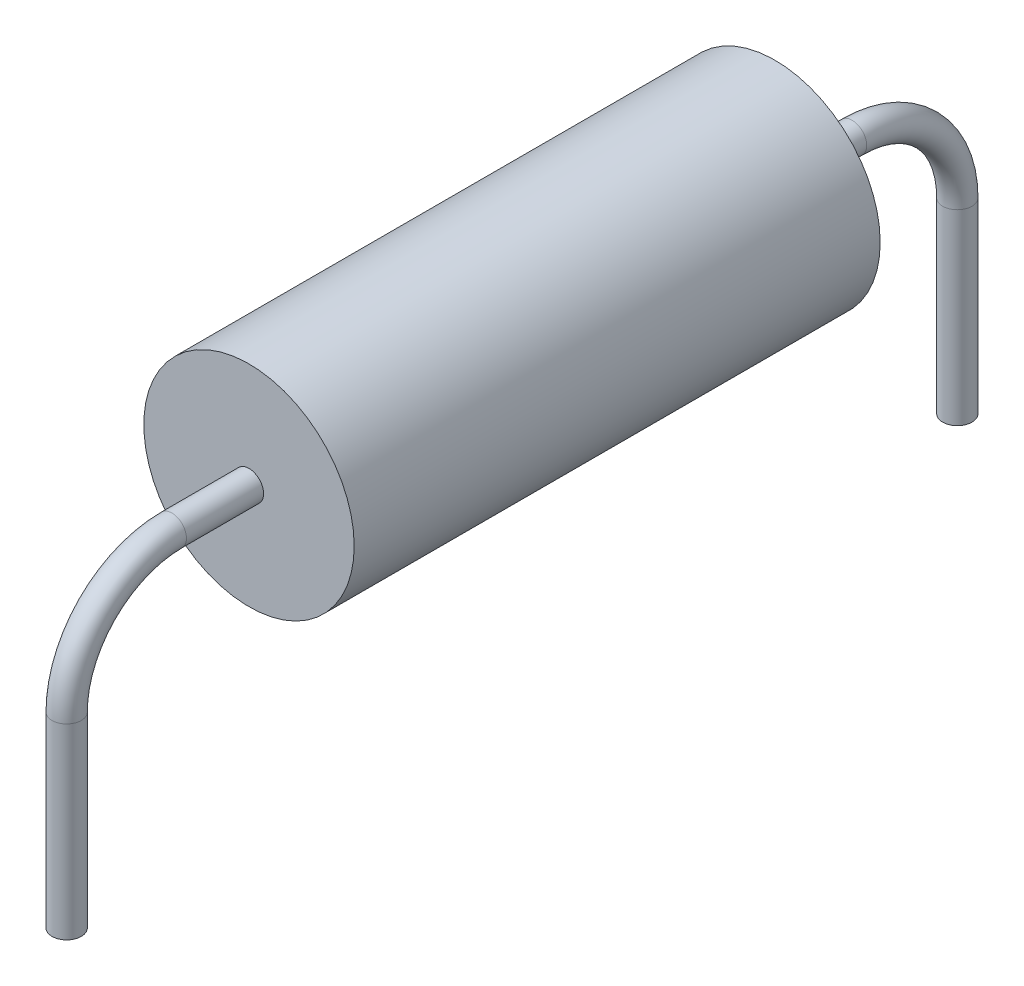
ISO-10303-21;
HEADER;
FILE_DESCRIPTION(('STEP AP214'),'2;1');
FILE_NAME('part.step','',(''),(''),'','','');
FILE_SCHEMA(('AUTOMOTIVE_DESIGN { 1 0 10303 214 1 1 1 1 }'));
ENDSEC;
DATA;
#1=APPLICATION_CONTEXT('core data for automotive mechanical design processes');
#2=APPLICATION_PROTOCOL_DEFINITION('international standard','automotive_design',2000,#1);
#3=PRODUCT_CONTEXT('',#1,'mechanical');
#4=PRODUCT('Part','Part','',(#3));
#5=PRODUCT_RELATED_PRODUCT_CATEGORY('part','',(#4));
#6=PRODUCT_DEFINITION_FORMATION('','',#4);
#7=PRODUCT_DEFINITION_CONTEXT('part definition',#1,'design');
#8=PRODUCT_DEFINITION('design','',#6,#7);
#9=PRODUCT_DEFINITION_SHAPE('','',#8);
#10=(LENGTH_UNIT() NAMED_UNIT(*) SI_UNIT(.MILLI.,.METRE.));
#11=(NAMED_UNIT(*) PLANE_ANGLE_UNIT() SI_UNIT($,.RADIAN.));
#12=(NAMED_UNIT(*) SI_UNIT($,.STERADIAN.) SOLID_ANGLE_UNIT());
#13=UNCERTAINTY_MEASURE_WITH_UNIT(LENGTH_MEASURE(1.E-05),#10,'distance_accuracy_value','');
#14=(GEOMETRIC_REPRESENTATION_CONTEXT(3) GLOBAL_UNCERTAINTY_ASSIGNED_CONTEXT((#13)) GLOBAL_UNIT_ASSIGNED_CONTEXT((#10,
#11,#12)) REPRESENTATION_CONTEXT('',''));
#15=CARTESIAN_POINT('',(0.,0.,0.));
#16=DIRECTION('',(0.,0.,1.));
#17=DIRECTION('',(1.,0.,0.));
#18=AXIS2_PLACEMENT_3D('',#15,#16,#17);
#19=CARTESIAN_POINT('',(0.,0.,-9.));
#20=DIRECTION('',(0.,0.,-1.));
#21=DIRECTION('',(-1.,0.,0.));
#22=AXIS2_PLACEMENT_3D('',#19,#20,#21);
#23=PLANE('',#22);
#24=CARTESIAN_POINT('',(0.,0.,-9.));
#25=DIRECTION('',(0.,0.,1.));
#26=DIRECTION('',(-1.,0.,0.));
#27=AXIS2_PLACEMENT_3D('',#24,#25,#26);
#28=CIRCLE('',#27,1.8);
#29=CARTESIAN_POINT('',(1.8,0.,-9.));
#30=VERTEX_POINT('',#29);
#31=EDGE_CURVE('E26',#30,#30,#28,.T.);
#32=ORIENTED_EDGE('',*,*,#31,.F.);
#33=EDGE_LOOP('',(#32));
#34=FACE_BOUND('',#33,.T.);
#35=CARTESIAN_POINT('',(0.,0.,-9.));
#36=DIRECTION('',(0.,0.,1.));
#37=DIRECTION('',(1.,0.,0.));
#38=AXIS2_PLACEMENT_3D('',#35,#36,#37);
#39=CIRCLE('',#38,0.25);
#40=CARTESIAN_POINT('',(-0.25,0.,-9.));
#41=VERTEX_POINT('',#40);
#42=EDGE_CURVE('E19',#41,#41,#39,.T.);
#43=ORIENTED_EDGE('',*,*,#42,.T.);
#44=EDGE_LOOP('',(#43));
#45=FACE_BOUND('',#44,.T.);
#46=ADVANCED_FACE('F15',(#34,#45),#23,.T.);
#47=CARTESIAN_POINT('',(0.,0.,0.));
#48=DIRECTION('',(0.,0.,-1.));
#49=DIRECTION('',(-1.,0.,0.));
#50=AXIS2_PLACEMENT_3D('',#47,#48,#49);
#51=PLANE('',#50);
#52=CARTESIAN_POINT('',(0.,0.,0.));
#53=DIRECTION('',(0.,0.,-1.));
#54=DIRECTION('',(-1.,0.,0.));
#55=AXIS2_PLACEMENT_3D('',#52,#53,#54);
#56=CIRCLE('',#55,1.8);
#57=CARTESIAN_POINT('',(1.8,0.,0.));
#58=VERTEX_POINT('',#57);
#59=EDGE_CURVE('E10',#58,#58,#56,.T.);
#60=ORIENTED_EDGE('',*,*,#59,.F.);
#61=EDGE_LOOP('',(#60));
#62=FACE_BOUND('',#61,.T.);
#63=CARTESIAN_POINT('',(0.,0.,0.));
#64=DIRECTION('',(0.,0.,-1.));
#65=DIRECTION('',(-1.,0.,0.));
#66=AXIS2_PLACEMENT_3D('',#63,#64,#65);
#67=CIRCLE('',#66,0.25);
#68=CARTESIAN_POINT('',(0.25,0.,0.));
#69=VERTEX_POINT('',#68);
#70=EDGE_CURVE('E53',#69,#69,#67,.T.);
#71=ORIENTED_EDGE('',*,*,#70,.T.);
#72=EDGE_LOOP('',(#71));
#73=FACE_BOUND('',#72,.T.);
#74=ADVANCED_FACE('F110',(#62,#73),#51,.F.);
#75=CARTESIAN_POINT('',(0.,0.,0.));
#76=DIRECTION('',(0.,0.,1.));
#77=DIRECTION('',(-1.,0.,0.));
#78=AXIS2_PLACEMENT_3D('',#75,#76,#77);
#79=CYLINDRICAL_SURFACE('',#78,1.8);
#80=ORIENTED_EDGE('',*,*,#59,.T.);
#81=EDGE_LOOP('',(#80));
#82=FACE_BOUND('',#81,.T.);
#83=ORIENTED_EDGE('',*,*,#31,.T.);
#84=EDGE_LOOP('',(#83));
#85=FACE_BOUND('',#84,.T.);
#86=ADVANCED_FACE('F106',(#82,#85),#79,.T.);
#87=CARTESIAN_POINT('',(0.,-5.,-12.12));
#88=DIRECTION('',(0.,1.,0.));
#89=DIRECTION('',(0.,0.,1.));
#90=AXIS2_PLACEMENT_3D('',#87,#88,#89);
#91=PLANE('',#90);
#92=CARTESIAN_POINT('',(0.,-5.,-12.12));
#93=DIRECTION('',(0.,1.,0.));
#94=DIRECTION('',(1.,0.,0.));
#95=AXIS2_PLACEMENT_3D('',#92,#93,#94);
#96=CIRCLE('',#95,0.25);
#97=CARTESIAN_POINT('',(-0.25,-5.,-12.12));
#98=VERTEX_POINT('',#97);
#99=EDGE_CURVE('E79',#98,#98,#96,.T.);
#100=ORIENTED_EDGE('',*,*,#99,.F.);
#101=EDGE_LOOP('',(#100));
#102=FACE_BOUND('',#101,.T.);
#103=ADVANCED_FACE('F96',(#102),#91,.F.);
#104=CARTESIAN_POINT('',(0.,0.,-9.));
#105=DIRECTION('',(0.,0.,1.));
#106=DIRECTION('',(1.,0.,0.));
#107=AXIS2_PLACEMENT_3D('',#104,#105,#106);
#108=CYLINDRICAL_SURFACE('',#107,0.25);
#109=ORIENTED_EDGE('',*,*,#42,.F.);
#110=EDGE_LOOP('',(#109));
#111=FACE_BOUND('',#110,.T.);
#112=CARTESIAN_POINT('',(0.,0.,-10.32));
#113=DIRECTION('',(0.,0.,1.));
#114=DIRECTION('',(1.,0.,0.));
#115=AXIS2_PLACEMENT_3D('',#112,#113,#114);
#116=CIRCLE('',#115,0.25);
#117=CARTESIAN_POINT('',(-0.25,0.,-10.32));
#118=VERTEX_POINT('',#117);
#119=EDGE_CURVE('E78',#118,#118,#116,.T.);
#120=ORIENTED_EDGE('',*,*,#119,.T.);
#121=EDGE_LOOP('',(#120));
#122=FACE_BOUND('',#121,.T.);
#123=ADVANCED_FACE('F93',(#111,#122),#108,.T.);
#124=CARTESIAN_POINT('',(0.,-1.8,-10.32));
#125=DIRECTION('',(-1.,0.,0.));
#126=DIRECTION('',(0.,0.,1.));
#127=AXIS2_PLACEMENT_3D('',#124,#125,#126);
#128=TOROIDAL_SURFACE('',#127,1.8,0.25);
#129=ORIENTED_EDGE('',*,*,#119,.F.);
#130=EDGE_LOOP('',(#129));
#131=FACE_BOUND('',#130,.T.);
#132=CARTESIAN_POINT('',(0.,-1.8,-12.12));
#133=DIRECTION('',(0.,1.,0.));
#134=DIRECTION('',(1.,0.,0.));
#135=AXIS2_PLACEMENT_3D('',#132,#133,#134);
#136=CIRCLE('',#135,0.25);
#137=CARTESIAN_POINT('',(-0.25,-1.8,-12.12));
#138=VERTEX_POINT('',#137);
#139=EDGE_CURVE('E75',#138,#138,#136,.T.);
#140=ORIENTED_EDGE('',*,*,#139,.T.);
#141=EDGE_LOOP('',(#140));
#142=FACE_BOUND('',#141,.T.);
#143=ADVANCED_FACE('F95',(#131,#142),#128,.T.);
#144=CARTESIAN_POINT('',(0.,-1.8,-12.12));
#145=DIRECTION('',(0.,1.,0.));
#146=DIRECTION('',(1.,0.,0.));
#147=AXIS2_PLACEMENT_3D('',#144,#145,#146);
#148=CYLINDRICAL_SURFACE('',#147,0.25);
#149=ORIENTED_EDGE('',*,*,#139,.F.);
#150=EDGE_LOOP('',(#149));
#151=FACE_BOUND('',#150,.T.);
#152=ORIENTED_EDGE('',*,*,#99,.T.);
#153=EDGE_LOOP('',(#152));
#154=FACE_BOUND('',#153,.T.);
#155=ADVANCED_FACE('F103',(#151,#154),#148,.T.);
#156=CARTESIAN_POINT('',(0.,-5.,3.12));
#157=DIRECTION('',(0.,1.,0.));
#158=DIRECTION('',(0.,0.,1.));
#159=AXIS2_PLACEMENT_3D('',#156,#157,#158);
#160=PLANE('',#159);
#161=CARTESIAN_POINT('',(0.,-5.,3.12));
#162=DIRECTION('',(0.,1.,0.));
#163=DIRECTION('',(-1.,0.,0.));
#164=AXIS2_PLACEMENT_3D('',#161,#162,#163);
#165=CIRCLE('',#164,0.25);
#166=CARTESIAN_POINT('',(0.25,-5.,3.12));
#167=VERTEX_POINT('',#166);
#168=EDGE_CURVE('E62',#167,#167,#165,.T.);
#169=ORIENTED_EDGE('',*,*,#168,.F.);
#170=EDGE_LOOP('',(#169));
#171=FACE_BOUND('',#170,.T.);
#172=ADVANCED_FACE('F156',(#171),#160,.F.);
#173=CARTESIAN_POINT('',(0.,0.,0.));
#174=DIRECTION('',(0.,0.,-1.));
#175=DIRECTION('',(-1.,0.,0.));
#176=AXIS2_PLACEMENT_3D('',#173,#174,#175);
#177=CYLINDRICAL_SURFACE('',#176,0.25);
#178=ORIENTED_EDGE('',*,*,#70,.F.);
#179=EDGE_LOOP('',(#178));
#180=FACE_BOUND('',#179,.T.);
#181=CARTESIAN_POINT('',(0.,0.,1.32));
#182=DIRECTION('',(0.,0.,-1.));
#183=DIRECTION('',(-1.,0.,0.));
#184=AXIS2_PLACEMENT_3D('',#181,#182,#183);
#185=CIRCLE('',#184,0.25);
#186=CARTESIAN_POINT('',(0.25,0.,1.32));
#187=VERTEX_POINT('',#186);
#188=EDGE_CURVE('E48',#187,#187,#185,.T.);
#189=ORIENTED_EDGE('',*,*,#188,.T.);
#190=EDGE_LOOP('',(#189));
#191=FACE_BOUND('',#190,.T.);
#192=ADVANCED_FACE('F17',(#180,#191),#177,.T.);
#193=CARTESIAN_POINT('',(0.,-1.8,1.32));
#194=DIRECTION('',(1.,0.,0.));
#195=DIRECTION('',(0.,0.,-1.));
#196=AXIS2_PLACEMENT_3D('',#193,#194,#195);
#197=TOROIDAL_SURFACE('',#196,1.8,0.25);
#198=ORIENTED_EDGE('',*,*,#188,.F.);
#199=EDGE_LOOP('',(#198));
#200=FACE_BOUND('',#199,.T.);
#201=CARTESIAN_POINT('',(0.,-1.8,3.12));
#202=DIRECTION('',(0.,1.,0.));
#203=DIRECTION('',(-1.,0.,0.));
#204=AXIS2_PLACEMENT_3D('',#201,#202,#203);
#205=CIRCLE('',#204,0.25);
#206=CARTESIAN_POINT('',(0.25,-1.8,3.12));
#207=VERTEX_POINT('',#206);
#208=EDGE_CURVE('E66',#207,#207,#205,.T.);
#209=ORIENTED_EDGE('',*,*,#208,.T.);
#210=EDGE_LOOP('',(#209));
#211=FACE_BOUND('',#210,.T.);
#212=ADVANCED_FACE('F175',(#200,#211),#197,.T.);
#213=CARTESIAN_POINT('',(0.,-1.8,3.12));
#214=DIRECTION('',(0.,1.,0.));
#215=DIRECTION('',(-1.,0.,0.));
#216=AXIS2_PLACEMENT_3D('',#213,#214,#215);
#217=CYLINDRICAL_SURFACE('',#216,0.25);
#218=ORIENTED_EDGE('',*,*,#208,.F.);
#219=EDGE_LOOP('',(#218));
#220=FACE_BOUND('',#219,.T.);
#221=ORIENTED_EDGE('',*,*,#168,.T.);
#222=EDGE_LOOP('',(#221));
#223=FACE_BOUND('',#222,.T.);
#224=ADVANCED_FACE('F63',(#220,#223),#217,.T.);
#225=CLOSED_SHELL('',(#46,#74,#86,#103,#123,#143,#155,#172,#192,#212,#224));
#226=MANIFOLD_SOLID_BREP('B1',#225);
#227=ADVANCED_BREP_SHAPE_REPRESENTATION('',(#18,#226),#14);
#228=SHAPE_DEFINITION_REPRESENTATION(#9,#227);
ENDSEC;
END-ISO-10303-21;
